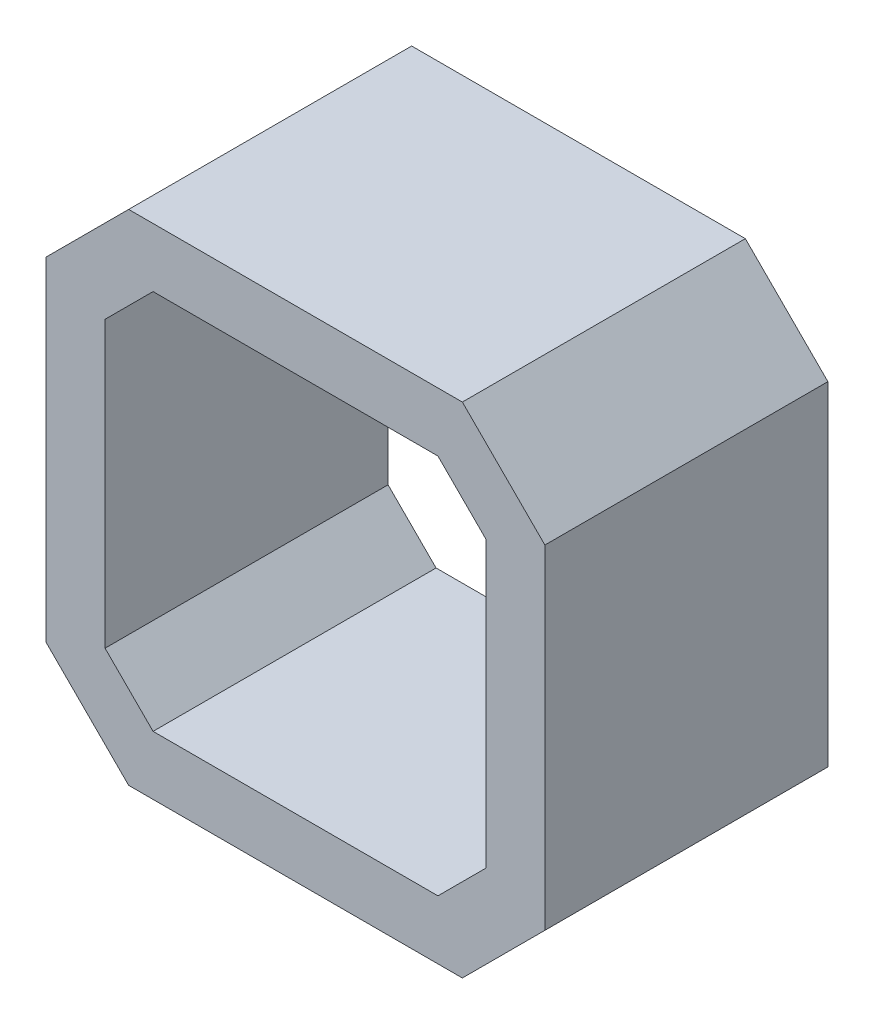
ISO-10303-21;
HEADER;
FILE_DESCRIPTION(('STEP AP214'),'2;1');
FILE_NAME('part.step','',(''),(''),'','','');
FILE_SCHEMA(('AUTOMOTIVE_DESIGN { 1 0 10303 214 1 1 1 1 }'));
ENDSEC;
DATA;
#1=APPLICATION_CONTEXT('core data for automotive mechanical design processes');
#2=APPLICATION_PROTOCOL_DEFINITION('international standard','automotive_design',2000,#1);
#3=PRODUCT_CONTEXT('',#1,'mechanical');
#4=PRODUCT('Part','Part','',(#3));
#5=PRODUCT_RELATED_PRODUCT_CATEGORY('part','',(#4));
#6=PRODUCT_DEFINITION_FORMATION('','',#4);
#7=PRODUCT_DEFINITION_CONTEXT('part definition',#1,'design');
#8=PRODUCT_DEFINITION('design','',#6,#7);
#9=PRODUCT_DEFINITION_SHAPE('','',#8);
#10=(LENGTH_UNIT() NAMED_UNIT(*) SI_UNIT(.MILLI.,.METRE.));
#11=(NAMED_UNIT(*) PLANE_ANGLE_UNIT() SI_UNIT($,.RADIAN.));
#12=(NAMED_UNIT(*) SI_UNIT($,.STERADIAN.) SOLID_ANGLE_UNIT());
#13=UNCERTAINTY_MEASURE_WITH_UNIT(LENGTH_MEASURE(1.E-05),#10,'distance_accuracy_value','');
#14=(GEOMETRIC_REPRESENTATION_CONTEXT(3) GLOBAL_UNCERTAINTY_ASSIGNED_CONTEXT((#13)) GLOBAL_UNIT_ASSIGNED_CONTEXT((#10,
#11,#12)) REPRESENTATION_CONTEXT('',''));
#15=CARTESIAN_POINT('',(0.,0.,0.));
#16=DIRECTION('',(0.,0.,1.));
#17=DIRECTION('',(1.,0.,0.));
#18=AXIS2_PLACEMENT_3D('',#15,#16,#17);
#19=CARTESIAN_POINT('',(0.,0.,24.));
#20=DIRECTION('',(0.,0.,-1.));
#21=DIRECTION('',(-1.,0.,0.));
#22=AXIS2_PLACEMENT_3D('',#19,#20,#21);
#23=PLANE('',#22);
#24=DIRECTION('',(-1.,0.,0.));
#25=VECTOR('',#24,1.);
#26=CARTESIAN_POINT('',(14.15,21.15,24.));
#27=LINE('',#26,#25);
#28=CARTESIAN_POINT('',(14.15,21.15,24.));
#29=VERTEX_POINT('',#28);
#30=CARTESIAN_POINT('',(-14.15,21.15,24.));
#31=VERTEX_POINT('',#30);
#32=EDGE_CURVE('E210',#29,#31,#27,.T.);
#33=ORIENTED_EDGE('',*,*,#32,.T.);
#34=DIRECTION('',(-0.707106781186547,-0.707106781186547,0.));
#35=VECTOR('',#34,1.);
#36=CARTESIAN_POINT('',(-14.15,21.15,24.));
#37=LINE('',#36,#35);
#38=CARTESIAN_POINT('',(-21.15,14.15,24.));
#39=VERTEX_POINT('',#38);
#40=EDGE_CURVE('E213',#31,#39,#37,.T.);
#41=ORIENTED_EDGE('',*,*,#40,.T.);
#42=DIRECTION('',(0.,-1.,0.));
#43=VECTOR('',#42,1.);
#44=CARTESIAN_POINT('',(-21.15,-14.15,24.));
#45=LINE('',#44,#43);
#46=CARTESIAN_POINT('',(-21.15,-14.15,24.));
#47=VERTEX_POINT('',#46);
#48=EDGE_CURVE('E216',#39,#47,#45,.T.);
#49=ORIENTED_EDGE('',*,*,#48,.T.);
#50=DIRECTION('',(0.707106781186547,-0.707106781186547,0.));
#51=VECTOR('',#50,1.);
#52=CARTESIAN_POINT('',(-14.15,-21.15,24.));
#53=LINE('',#52,#51);
#54=CARTESIAN_POINT('',(-14.15,-21.15,24.));
#55=VERTEX_POINT('',#54);
#56=EDGE_CURVE('E218',#47,#55,#53,.T.);
#57=ORIENTED_EDGE('',*,*,#56,.T.);
#58=DIRECTION('',(1.,0.,0.));
#59=VECTOR('',#58,1.);
#60=CARTESIAN_POINT('',(14.15,-21.15,24.));
#61=LINE('',#60,#59);
#62=CARTESIAN_POINT('',(14.15,-21.15,24.));
#63=VERTEX_POINT('',#62);
#64=EDGE_CURVE('E220',#55,#63,#61,.T.);
#65=ORIENTED_EDGE('',*,*,#64,.T.);
#66=DIRECTION('',(0.707106781186547,0.707106781186548,0.));
#67=VECTOR('',#66,1.);
#68=CARTESIAN_POINT('',(21.15,-14.15,24.));
#69=LINE('',#68,#67);
#70=CARTESIAN_POINT('',(21.15,-14.15,24.));
#71=VERTEX_POINT('',#70);
#72=EDGE_CURVE('E222',#63,#71,#69,.T.);
#73=ORIENTED_EDGE('',*,*,#72,.T.);
#74=DIRECTION('',(0.,1.,0.));
#75=VECTOR('',#74,1.);
#76=CARTESIAN_POINT('',(21.15,-14.15,24.));
#77=LINE('',#76,#75);
#78=CARTESIAN_POINT('',(21.15,14.15,24.));
#79=VERTEX_POINT('',#78);
#80=EDGE_CURVE('E224',#71,#79,#77,.T.);
#81=ORIENTED_EDGE('',*,*,#80,.T.);
#82=DIRECTION('',(-0.707106781186548,0.707106781186547,0.));
#83=VECTOR('',#82,1.);
#84=CARTESIAN_POINT('',(21.15,14.15,24.));
#85=LINE('',#84,#83);
#86=EDGE_CURVE('E226',#79,#29,#85,.T.);
#87=ORIENTED_EDGE('',*,*,#86,.T.);
#88=EDGE_LOOP('',(#33,#41,#49,#57,#65,#73,#81,#87));
#89=FACE_BOUND('',#88,.T.);
#90=DIRECTION('',(-1.,0.,0.));
#91=VECTOR('',#90,1.);
#92=CARTESIAN_POINT('',(12.0789321881345,16.15,24.));
#93=LINE('',#92,#91);
#94=CARTESIAN_POINT('',(12.0789321881345,16.15,24.));
#95=VERTEX_POINT('',#94);
#96=CARTESIAN_POINT('',(-12.0789321881345,16.15,24.));
#97=VERTEX_POINT('',#96);
#98=EDGE_CURVE('E145',#95,#97,#93,.T.);
#99=ORIENTED_EDGE('',*,*,#98,.F.);
#100=DIRECTION('',(-0.707106781186547,0.707106781186547,0.));
#101=VECTOR('',#100,1.);
#102=CARTESIAN_POINT('',(16.15,12.0789321881345,24.));
#103=LINE('',#102,#101);
#104=CARTESIAN_POINT('',(16.15,12.0789321881345,24.));
#105=VERTEX_POINT('',#104);
#106=EDGE_CURVE('E178',#105,#95,#103,.T.);
#107=ORIENTED_EDGE('',*,*,#106,.F.);
#108=DIRECTION('',(0.,1.,0.));
#109=VECTOR('',#108,1.);
#110=CARTESIAN_POINT('',(16.15,-12.0789321881345,24.));
#111=LINE('',#110,#109);
#112=CARTESIAN_POINT('',(16.15,-12.0789321881345,24.));
#113=VERTEX_POINT('',#112);
#114=EDGE_CURVE('E176',#113,#105,#111,.T.);
#115=ORIENTED_EDGE('',*,*,#114,.F.);
#116=DIRECTION('',(0.707106781186547,0.707106781186547,0.));
#117=VECTOR('',#116,1.);
#118=CARTESIAN_POINT('',(16.15,-12.0789321881345,24.));
#119=LINE('',#118,#117);
#120=CARTESIAN_POINT('',(12.0789321881345,-16.15,24.));
#121=VERTEX_POINT('',#120);
#122=EDGE_CURVE('E174',#121,#113,#119,.T.);
#123=ORIENTED_EDGE('',*,*,#122,.F.);
#124=DIRECTION('',(1.,0.,0.));
#125=VECTOR('',#124,1.);
#126=CARTESIAN_POINT('',(12.0789321881345,-16.15,24.));
#127=LINE('',#126,#125);
#128=CARTESIAN_POINT('',(-12.0789321881345,-16.15,24.));
#129=VERTEX_POINT('',#128);
#130=EDGE_CURVE('E172',#129,#121,#127,.T.);
#131=ORIENTED_EDGE('',*,*,#130,.F.);
#132=DIRECTION('',(0.707106781186548,-0.707106781186548,0.));
#133=VECTOR('',#132,1.);
#134=CARTESIAN_POINT('',(-12.0789321881345,-16.15,24.));
#135=LINE('',#134,#133);
#136=CARTESIAN_POINT('',(-16.15,-12.0789321881345,24.));
#137=VERTEX_POINT('',#136);
#138=EDGE_CURVE('E168',#137,#129,#135,.T.);
#139=ORIENTED_EDGE('',*,*,#138,.F.);
#140=DIRECTION('',(0.,-1.,0.));
#141=VECTOR('',#140,1.);
#142=CARTESIAN_POINT('',(-16.15,-12.0789321881345,24.));
#143=LINE('',#142,#141);
#144=CARTESIAN_POINT('',(-16.15,12.0789321881345,24.));
#145=VERTEX_POINT('',#144);
#146=EDGE_CURVE('E166',#145,#137,#143,.T.);
#147=ORIENTED_EDGE('',*,*,#146,.F.);
#148=DIRECTION('',(-0.707106781186548,-0.707106781186548,0.));
#149=VECTOR('',#148,1.);
#150=CARTESIAN_POINT('',(-12.0789321881345,16.15,24.));
#151=LINE('',#150,#149);
#152=EDGE_CURVE('E153',#97,#145,#151,.T.);
#153=ORIENTED_EDGE('',*,*,#152,.F.);
#154=EDGE_LOOP('',(#99,#107,#115,#123,#131,#139,#147,#153));
#155=FACE_BOUND('',#154,.T.);
#156=ADVANCED_FACE('F32',(#89,#155),#23,.F.);
#157=CARTESIAN_POINT('',(0.,0.,0.));
#158=DIRECTION('',(0.,0.,-1.));
#159=DIRECTION('',(-1.,0.,0.));
#160=AXIS2_PLACEMENT_3D('',#157,#158,#159);
#161=PLANE('',#160);
#162=DIRECTION('',(-1.,0.,0.));
#163=VECTOR('',#162,1.);
#164=CARTESIAN_POINT('',(14.15,21.15,0.));
#165=LINE('',#164,#163);
#166=CARTESIAN_POINT('',(14.15,21.15,0.));
#167=VERTEX_POINT('',#166);
#168=CARTESIAN_POINT('',(-14.15,21.15,0.));
#169=VERTEX_POINT('',#168);
#170=EDGE_CURVE('E161',#167,#169,#165,.T.);
#171=ORIENTED_EDGE('',*,*,#170,.F.);
#172=DIRECTION('',(-0.707106781186548,0.707106781186547,0.));
#173=VECTOR('',#172,1.);
#174=CARTESIAN_POINT('',(21.15,14.15,0.));
#175=LINE('',#174,#173);
#176=CARTESIAN_POINT('',(21.15,14.15,0.));
#177=VERTEX_POINT('',#176);
#178=EDGE_CURVE('E214',#177,#167,#175,.T.);
#179=ORIENTED_EDGE('',*,*,#178,.F.);
#180=DIRECTION('',(0.,1.,0.));
#181=VECTOR('',#180,1.);
#182=CARTESIAN_POINT('',(21.15,-14.15,0.));
#183=LINE('',#182,#181);
#184=CARTESIAN_POINT('',(21.15,-14.15,0.));
#185=VERTEX_POINT('',#184);
#186=EDGE_CURVE('E241',#185,#177,#183,.T.);
#187=ORIENTED_EDGE('',*,*,#186,.F.);
#188=DIRECTION('',(0.707106781186547,0.707106781186548,0.));
#189=VECTOR('',#188,1.);
#190=CARTESIAN_POINT('',(21.15,-14.15,0.));
#191=LINE('',#190,#189);
#192=CARTESIAN_POINT('',(14.15,-21.15,0.));
#193=VERTEX_POINT('',#192);
#194=EDGE_CURVE('E239',#193,#185,#191,.T.);
#195=ORIENTED_EDGE('',*,*,#194,.F.);
#196=DIRECTION('',(1.,0.,0.));
#197=VECTOR('',#196,1.);
#198=CARTESIAN_POINT('',(14.15,-21.15,0.));
#199=LINE('',#198,#197);
#200=CARTESIAN_POINT('',(-14.15,-21.15,0.));
#201=VERTEX_POINT('',#200);
#202=EDGE_CURVE('E237',#201,#193,#199,.T.);
#203=ORIENTED_EDGE('',*,*,#202,.F.);
#204=DIRECTION('',(0.707106781186547,-0.707106781186547,0.));
#205=VECTOR('',#204,1.);
#206=CARTESIAN_POINT('',(-14.15,-21.15,0.));
#207=LINE('',#206,#205);
#208=CARTESIAN_POINT('',(-21.15,-14.15,0.));
#209=VERTEX_POINT('',#208);
#210=EDGE_CURVE('E235',#209,#201,#207,.T.);
#211=ORIENTED_EDGE('',*,*,#210,.F.);
#212=DIRECTION('',(0.,-1.,0.));
#213=VECTOR('',#212,1.);
#214=CARTESIAN_POINT('',(-21.15,-14.15,0.));
#215=LINE('',#214,#213);
#216=CARTESIAN_POINT('',(-21.15,14.15,0.));
#217=VERTEX_POINT('',#216);
#218=EDGE_CURVE('E233',#217,#209,#215,.T.);
#219=ORIENTED_EDGE('',*,*,#218,.F.);
#220=DIRECTION('',(-0.707106781186547,-0.707106781186547,0.));
#221=VECTOR('',#220,1.);
#222=CARTESIAN_POINT('',(-14.15,21.15,0.));
#223=LINE('',#222,#221);
#224=EDGE_CURVE('E231',#169,#217,#223,.T.);
#225=ORIENTED_EDGE('',*,*,#224,.F.);
#226=EDGE_LOOP('',(#171,#179,#187,#195,#203,#211,#219,#225));
#227=FACE_BOUND('',#226,.T.);
#228=DIRECTION('',(-0.707106781186547,0.707106781186547,0.));
#229=VECTOR('',#228,1.);
#230=CARTESIAN_POINT('',(16.15,12.0789321881345,0.));
#231=LINE('',#230,#229);
#232=CARTESIAN_POINT('',(16.15,12.0789321881345,0.));
#233=VERTEX_POINT('',#232);
#234=CARTESIAN_POINT('',(12.0789321881345,16.15,0.));
#235=VERTEX_POINT('',#234);
#236=EDGE_CURVE('E154',#233,#235,#231,.T.);
#237=ORIENTED_EDGE('',*,*,#236,.T.);
#238=DIRECTION('',(-1.,0.,0.));
#239=VECTOR('',#238,1.);
#240=CARTESIAN_POINT('',(12.0789321881345,16.15,0.));
#241=LINE('',#240,#239);
#242=CARTESIAN_POINT('',(-12.0789321881345,16.15,0.));
#243=VERTEX_POINT('',#242);
#244=EDGE_CURVE('E55',#235,#243,#241,.T.);
#245=ORIENTED_EDGE('',*,*,#244,.T.);
#246=DIRECTION('',(-0.707106781186548,-0.707106781186548,0.));
#247=VECTOR('',#246,1.);
#248=CARTESIAN_POINT('',(-12.0789321881345,16.15,0.));
#249=LINE('',#248,#247);
#250=CARTESIAN_POINT('',(-16.15,12.0789321881345,0.));
#251=VERTEX_POINT('',#250);
#252=EDGE_CURVE('E160',#243,#251,#249,.T.);
#253=ORIENTED_EDGE('',*,*,#252,.T.);
#254=DIRECTION('',(0.,-1.,0.));
#255=VECTOR('',#254,1.);
#256=CARTESIAN_POINT('',(-16.15,-12.0789321881345,0.));
#257=LINE('',#256,#255);
#258=CARTESIAN_POINT('',(-16.15,-12.0789321881345,0.));
#259=VERTEX_POINT('',#258);
#260=EDGE_CURVE('E182',#251,#259,#257,.T.);
#261=ORIENTED_EDGE('',*,*,#260,.T.);
#262=DIRECTION('',(0.707106781186548,-0.707106781186548,0.));
#263=VECTOR('',#262,1.);
#264=CARTESIAN_POINT('',(-12.0789321881345,-16.15,0.));
#265=LINE('',#264,#263);
#266=CARTESIAN_POINT('',(-12.0789321881345,-16.15,0.));
#267=VERTEX_POINT('',#266);
#268=EDGE_CURVE('E185',#259,#267,#265,.T.);
#269=ORIENTED_EDGE('',*,*,#268,.T.);
#270=DIRECTION('',(1.,0.,0.));
#271=VECTOR('',#270,1.);
#272=CARTESIAN_POINT('',(12.0789321881345,-16.15,0.));
#273=LINE('',#272,#271);
#274=CARTESIAN_POINT('',(12.0789321881345,-16.15,0.));
#275=VERTEX_POINT('',#274);
#276=EDGE_CURVE('E188',#267,#275,#273,.T.);
#277=ORIENTED_EDGE('',*,*,#276,.T.);
#278=DIRECTION('',(0.707106781186547,0.707106781186547,0.));
#279=VECTOR('',#278,1.);
#280=CARTESIAN_POINT('',(16.15,-12.0789321881345,0.));
#281=LINE('',#280,#279);
#282=CARTESIAN_POINT('',(16.15,-12.0789321881345,0.));
#283=VERTEX_POINT('',#282);
#284=EDGE_CURVE('E191',#275,#283,#281,.T.);
#285=ORIENTED_EDGE('',*,*,#284,.T.);
#286=DIRECTION('',(0.,1.,0.));
#287=VECTOR('',#286,1.);
#288=CARTESIAN_POINT('',(16.15,-12.0789321881345,0.));
#289=LINE('',#288,#287);
#290=EDGE_CURVE('E194',#283,#233,#289,.T.);
#291=ORIENTED_EDGE('',*,*,#290,.T.);
#292=EDGE_LOOP('',(#237,#245,#253,#261,#269,#277,#285,#291));
#293=FACE_BOUND('',#292,.T.);
#294=ADVANCED_FACE('F271',(#227,#293),#161,.T.);
#295=CARTESIAN_POINT('',(14.15,21.15,24.));
#296=DIRECTION('',(0.,-1.,0.));
#297=DIRECTION('',(1.,0.,0.));
#298=AXIS2_PLACEMENT_3D('',#295,#296,#297);
#299=PLANE('',#298);
#300=ORIENTED_EDGE('',*,*,#170,.T.);
#301=DIRECTION('',(0.,0.,-1.));
#302=VECTOR('',#301,1.);
#303=CARTESIAN_POINT('',(-14.15,21.15,24.));
#304=LINE('',#303,#302);
#305=EDGE_CURVE('E11',#31,#169,#304,.T.);
#306=ORIENTED_EDGE('',*,*,#305,.F.);
#307=ORIENTED_EDGE('',*,*,#32,.F.);
#308=DIRECTION('',(0.,0.,-1.));
#309=VECTOR('',#308,1.);
#310=CARTESIAN_POINT('',(14.15,21.15,24.));
#311=LINE('',#310,#309);
#312=EDGE_CURVE('E228',#29,#167,#311,.T.);
#313=ORIENTED_EDGE('',*,*,#312,.T.);
#314=EDGE_LOOP('',(#300,#306,#307,#313));
#315=FACE_BOUND('',#314,.T.);
#316=ADVANCED_FACE('F34',(#315),#299,.F.);
#317=CARTESIAN_POINT('',(-14.15,21.15,24.));
#318=DIRECTION('',(0.707106781186548,-0.707106781186548,0.));
#319=DIRECTION('',(0.707106781186548,0.707106781186548,0.));
#320=AXIS2_PLACEMENT_3D('',#317,#318,#319);
#321=PLANE('',#320);
#322=ORIENTED_EDGE('',*,*,#224,.T.);
#323=DIRECTION('',(0.,0.,-1.));
#324=VECTOR('',#323,1.);
#325=CARTESIAN_POINT('',(-21.15,14.15,24.));
#326=LINE('',#325,#324);
#327=EDGE_CURVE('E40',#39,#217,#326,.T.);
#328=ORIENTED_EDGE('',*,*,#327,.F.);
#329=ORIENTED_EDGE('',*,*,#40,.F.);
#330=ORIENTED_EDGE('',*,*,#305,.T.);
#331=EDGE_LOOP('',(#322,#328,#329,#330));
#332=FACE_BOUND('',#331,.T.);
#333=ADVANCED_FACE('F288',(#332),#321,.F.);
#334=CARTESIAN_POINT('',(-21.15,-14.15,24.));
#335=DIRECTION('',(1.,0.,0.));
#336=DIRECTION('',(0.,0.,-1.));
#337=AXIS2_PLACEMENT_3D('',#334,#335,#336);
#338=PLANE('',#337);
#339=ORIENTED_EDGE('',*,*,#218,.T.);
#340=DIRECTION('',(0.,0.,-1.));
#341=VECTOR('',#340,1.);
#342=CARTESIAN_POINT('',(-21.15,-14.15,24.));
#343=LINE('',#342,#341);
#344=EDGE_CURVE('E258',#47,#209,#343,.T.);
#345=ORIENTED_EDGE('',*,*,#344,.F.);
#346=ORIENTED_EDGE('',*,*,#48,.F.);
#347=ORIENTED_EDGE('',*,*,#327,.T.);
#348=EDGE_LOOP('',(#339,#345,#346,#347));
#349=FACE_BOUND('',#348,.T.);
#350=ADVANCED_FACE('F265',(#349),#338,.F.);
#351=CARTESIAN_POINT('',(-14.15,-21.15,24.));
#352=DIRECTION('',(0.707106781186548,0.707106781186548,0.));
#353=DIRECTION('',(-0.707106781186548,0.707106781186548,0.));
#354=AXIS2_PLACEMENT_3D('',#351,#352,#353);
#355=PLANE('',#354);
#356=ORIENTED_EDGE('',*,*,#210,.T.);
#357=DIRECTION('',(0.,0.,-1.));
#358=VECTOR('',#357,1.);
#359=CARTESIAN_POINT('',(-14.15,-21.15,24.));
#360=LINE('',#359,#358);
#361=EDGE_CURVE('E255',#55,#201,#360,.T.);
#362=ORIENTED_EDGE('',*,*,#361,.F.);
#363=ORIENTED_EDGE('',*,*,#56,.F.);
#364=ORIENTED_EDGE('',*,*,#344,.T.);
#365=EDGE_LOOP('',(#356,#362,#363,#364));
#366=FACE_BOUND('',#365,.T.);
#367=ADVANCED_FACE('F277',(#366),#355,.F.);
#368=CARTESIAN_POINT('',(14.15,-21.15,24.));
#369=DIRECTION('',(0.,1.,0.));
#370=DIRECTION('',(-1.,0.,0.));
#371=AXIS2_PLACEMENT_3D('',#368,#369,#370);
#372=PLANE('',#371);
#373=ORIENTED_EDGE('',*,*,#202,.T.);
#374=DIRECTION('',(0.,0.,-1.));
#375=VECTOR('',#374,1.);
#376=CARTESIAN_POINT('',(14.15,-21.15,24.));
#377=LINE('',#376,#375);
#378=EDGE_CURVE('E252',#63,#193,#377,.T.);
#379=ORIENTED_EDGE('',*,*,#378,.F.);
#380=ORIENTED_EDGE('',*,*,#64,.F.);
#381=ORIENTED_EDGE('',*,*,#361,.T.);
#382=EDGE_LOOP('',(#373,#379,#380,#381));
#383=FACE_BOUND('',#382,.T.);
#384=ADVANCED_FACE('F281',(#383),#372,.F.);
#385=CARTESIAN_POINT('',(21.15,-14.15,24.));
#386=DIRECTION('',(-0.707106781186548,0.707106781186547,0.));
#387=DIRECTION('',(-0.707106781186547,-0.707106781186548,0.));
#388=AXIS2_PLACEMENT_3D('',#385,#386,#387);
#389=PLANE('',#388);
#390=ORIENTED_EDGE('',*,*,#194,.T.);
#391=DIRECTION('',(0.,0.,-1.));
#392=VECTOR('',#391,1.);
#393=CARTESIAN_POINT('',(21.15,-14.15,24.));
#394=LINE('',#393,#392);
#395=EDGE_CURVE('E249',#71,#185,#394,.T.);
#396=ORIENTED_EDGE('',*,*,#395,.F.);
#397=ORIENTED_EDGE('',*,*,#72,.F.);
#398=ORIENTED_EDGE('',*,*,#378,.T.);
#399=EDGE_LOOP('',(#390,#396,#397,#398));
#400=FACE_BOUND('',#399,.T.);
#401=ADVANCED_FACE('F301',(#400),#389,.F.);
#402=CARTESIAN_POINT('',(21.15,-14.15,24.));
#403=DIRECTION('',(-1.,0.,0.));
#404=DIRECTION('',(0.,0.,1.));
#405=AXIS2_PLACEMENT_3D('',#402,#403,#404);
#406=PLANE('',#405);
#407=ORIENTED_EDGE('',*,*,#186,.T.);
#408=DIRECTION('',(0.,0.,-1.));
#409=VECTOR('',#408,1.);
#410=CARTESIAN_POINT('',(21.15,14.15,24.));
#411=LINE('',#410,#409);
#412=EDGE_CURVE('E246',#79,#177,#411,.T.);
#413=ORIENTED_EDGE('',*,*,#412,.F.);
#414=ORIENTED_EDGE('',*,*,#80,.F.);
#415=ORIENTED_EDGE('',*,*,#395,.T.);
#416=EDGE_LOOP('',(#407,#413,#414,#415));
#417=FACE_BOUND('',#416,.T.);
#418=ADVANCED_FACE('F299',(#417),#406,.F.);
#419=CARTESIAN_POINT('',(21.15,14.15,24.));
#420=DIRECTION('',(-0.707106781186547,-0.707106781186548,0.));
#421=DIRECTION('',(0.707106781186548,-0.707106781186547,0.));
#422=AXIS2_PLACEMENT_3D('',#419,#420,#421);
#423=PLANE('',#422);
#424=ORIENTED_EDGE('',*,*,#178,.T.);
#425=ORIENTED_EDGE('',*,*,#312,.F.);
#426=ORIENTED_EDGE('',*,*,#86,.F.);
#427=ORIENTED_EDGE('',*,*,#412,.T.);
#428=EDGE_LOOP('',(#424,#425,#426,#427));
#429=FACE_BOUND('',#428,.T.);
#430=ADVANCED_FACE('F294',(#429),#423,.F.);
#431=CARTESIAN_POINT('',(12.0789321881345,16.15,24.));
#432=DIRECTION('',(0.,-1.,0.));
#433=DIRECTION('',(0.,0.,-1.));
#434=AXIS2_PLACEMENT_3D('',#431,#432,#433);
#435=PLANE('',#434);
#436=ORIENTED_EDGE('',*,*,#244,.F.);
#437=DIRECTION('',(0.,0.,-1.));
#438=VECTOR('',#437,1.);
#439=CARTESIAN_POINT('',(12.0789321881345,16.15,24.));
#440=LINE('',#439,#438);
#441=EDGE_CURVE('E149',#95,#235,#440,.T.);
#442=ORIENTED_EDGE('',*,*,#441,.F.);
#443=ORIENTED_EDGE('',*,*,#98,.T.);
#444=DIRECTION('',(0.,0.,-1.));
#445=VECTOR('',#444,1.);
#446=CARTESIAN_POINT('',(-12.0789321881345,16.15,24.));
#447=LINE('',#446,#445);
#448=EDGE_CURVE('E148',#97,#243,#447,.T.);
#449=ORIENTED_EDGE('',*,*,#448,.T.);
#450=EDGE_LOOP('',(#436,#442,#443,#449));
#451=FACE_BOUND('',#450,.T.);
#452=ADVANCED_FACE('F147',(#451),#435,.T.);
#453=CARTESIAN_POINT('',(-12.0789321881345,16.15,24.));
#454=DIRECTION('',(0.707106781186547,-0.707106781186547,0.));
#455=DIRECTION('',(0.707106781186548,0.707106781186548,0.));
#456=AXIS2_PLACEMENT_3D('',#453,#454,#455);
#457=PLANE('',#456);
#458=ORIENTED_EDGE('',*,*,#252,.F.);
#459=ORIENTED_EDGE('',*,*,#448,.F.);
#460=ORIENTED_EDGE('',*,*,#152,.T.);
#461=DIRECTION('',(0.,0.,-1.));
#462=VECTOR('',#461,1.);
#463=CARTESIAN_POINT('',(-16.15,12.0789321881345,24.));
#464=LINE('',#463,#462);
#465=EDGE_CURVE('E162',#145,#251,#464,.T.);
#466=ORIENTED_EDGE('',*,*,#465,.T.);
#467=EDGE_LOOP('',(#458,#459,#460,#466));
#468=FACE_BOUND('',#467,.T.);
#469=ADVANCED_FACE('F157',(#468),#457,.T.);
#470=CARTESIAN_POINT('',(-16.15,-12.0789321881345,24.));
#471=DIRECTION('',(1.,0.,0.));
#472=DIRECTION('',(0.,0.,-1.));
#473=AXIS2_PLACEMENT_3D('',#470,#471,#472);
#474=PLANE('',#473);
#475=ORIENTED_EDGE('',*,*,#260,.F.);
#476=ORIENTED_EDGE('',*,*,#465,.F.);
#477=ORIENTED_EDGE('',*,*,#146,.T.);
#478=DIRECTION('',(0.,0.,-1.));
#479=VECTOR('',#478,1.);
#480=CARTESIAN_POINT('',(-16.15,-12.0789321881345,24.));
#481=LINE('',#480,#479);
#482=EDGE_CURVE('E207',#137,#259,#481,.T.);
#483=ORIENTED_EDGE('',*,*,#482,.T.);
#484=EDGE_LOOP('',(#475,#476,#477,#483));
#485=FACE_BOUND('',#484,.T.);
#486=ADVANCED_FACE('F326',(#485),#474,.T.);
#487=CARTESIAN_POINT('',(-12.0789321881345,-16.15,24.));
#488=DIRECTION('',(0.707106781186547,0.707106781186547,0.));
#489=DIRECTION('',(-0.707106781186548,0.707106781186548,0.));
#490=AXIS2_PLACEMENT_3D('',#487,#488,#489);
#491=PLANE('',#490);
#492=ORIENTED_EDGE('',*,*,#268,.F.);
#493=ORIENTED_EDGE('',*,*,#482,.F.);
#494=ORIENTED_EDGE('',*,*,#138,.T.);
#495=DIRECTION('',(0.,0.,-1.));
#496=VECTOR('',#495,1.);
#497=CARTESIAN_POINT('',(-12.0789321881345,-16.15,24.));
#498=LINE('',#497,#496);
#499=EDGE_CURVE('E205',#129,#267,#498,.T.);
#500=ORIENTED_EDGE('',*,*,#499,.T.);
#501=EDGE_LOOP('',(#492,#493,#494,#500));
#502=FACE_BOUND('',#501,.T.);
#503=ADVANCED_FACE('F330',(#502),#491,.T.);
#504=CARTESIAN_POINT('',(12.0789321881345,-16.15,24.));
#505=DIRECTION('',(0.,1.,0.));
#506=DIRECTION('',(0.,0.,1.));
#507=AXIS2_PLACEMENT_3D('',#504,#505,#506);
#508=PLANE('',#507);
#509=ORIENTED_EDGE('',*,*,#276,.F.);
#510=ORIENTED_EDGE('',*,*,#499,.F.);
#511=ORIENTED_EDGE('',*,*,#130,.T.);
#512=DIRECTION('',(0.,0.,-1.));
#513=VECTOR('',#512,1.);
#514=CARTESIAN_POINT('',(12.0789321881345,-16.15,24.));
#515=LINE('',#514,#513);
#516=EDGE_CURVE('E203',#121,#275,#515,.T.);
#517=ORIENTED_EDGE('',*,*,#516,.T.);
#518=EDGE_LOOP('',(#509,#510,#511,#517));
#519=FACE_BOUND('',#518,.T.);
#520=ADVANCED_FACE('F336',(#519),#508,.T.);
#521=CARTESIAN_POINT('',(16.15,-12.0789321881345,24.));
#522=DIRECTION('',(-0.707106781186548,0.707106781186548,0.));
#523=DIRECTION('',(-0.707106781186548,-0.707106781186548,0.));
#524=AXIS2_PLACEMENT_3D('',#521,#522,#523);
#525=PLANE('',#524);
#526=ORIENTED_EDGE('',*,*,#284,.F.);
#527=ORIENTED_EDGE('',*,*,#516,.F.);
#528=ORIENTED_EDGE('',*,*,#122,.T.);
#529=DIRECTION('',(0.,0.,-1.));
#530=VECTOR('',#529,1.);
#531=CARTESIAN_POINT('',(16.15,-12.0789321881345,24.));
#532=LINE('',#531,#530);
#533=EDGE_CURVE('E201',#113,#283,#532,.T.);
#534=ORIENTED_EDGE('',*,*,#533,.T.);
#535=EDGE_LOOP('',(#526,#527,#528,#534));
#536=FACE_BOUND('',#535,.T.);
#537=ADVANCED_FACE('F340',(#536),#525,.T.);
#538=CARTESIAN_POINT('',(16.15,-12.0789321881345,24.));
#539=DIRECTION('',(-1.,0.,0.));
#540=DIRECTION('',(0.,0.,1.));
#541=AXIS2_PLACEMENT_3D('',#538,#539,#540);
#542=PLANE('',#541);
#543=ORIENTED_EDGE('',*,*,#290,.F.);
#544=ORIENTED_EDGE('',*,*,#533,.F.);
#545=ORIENTED_EDGE('',*,*,#114,.T.);
#546=DIRECTION('',(0.,0.,-1.));
#547=VECTOR('',#546,1.);
#548=CARTESIAN_POINT('',(16.15,12.0789321881345,24.));
#549=LINE('',#548,#547);
#550=EDGE_CURVE('E47',#105,#233,#549,.T.);
#551=ORIENTED_EDGE('',*,*,#550,.T.);
#552=EDGE_LOOP('',(#543,#544,#545,#551));
#553=FACE_BOUND('',#552,.T.);
#554=ADVANCED_FACE('F344',(#553),#542,.T.);
#555=CARTESIAN_POINT('',(16.15,12.0789321881345,24.));
#556=DIRECTION('',(-0.707106781186548,-0.707106781186548,0.));
#557=DIRECTION('',(0.707106781186548,-0.707106781186548,0.));
#558=AXIS2_PLACEMENT_3D('',#555,#556,#557);
#559=PLANE('',#558);
#560=ORIENTED_EDGE('',*,*,#236,.F.);
#561=ORIENTED_EDGE('',*,*,#550,.F.);
#562=ORIENTED_EDGE('',*,*,#106,.T.);
#563=ORIENTED_EDGE('',*,*,#441,.T.);
#564=EDGE_LOOP('',(#560,#561,#562,#563));
#565=FACE_BOUND('',#564,.T.);
#566=ADVANCED_FACE('F348',(#565),#559,.T.);
#567=CLOSED_SHELL('',(#156,#294,#316,#333,#350,#367,#384,#401,#418,#430,#452,#469,#486,#503,
#520,#537,#554,#566));
#568=MANIFOLD_SOLID_BREP('B2',#567);
#569=ADVANCED_BREP_SHAPE_REPRESENTATION('',(#18,#568),#14);
#570=SHAPE_DEFINITION_REPRESENTATION(#9,#569);
ENDSEC;
END-ISO-10303-21;
